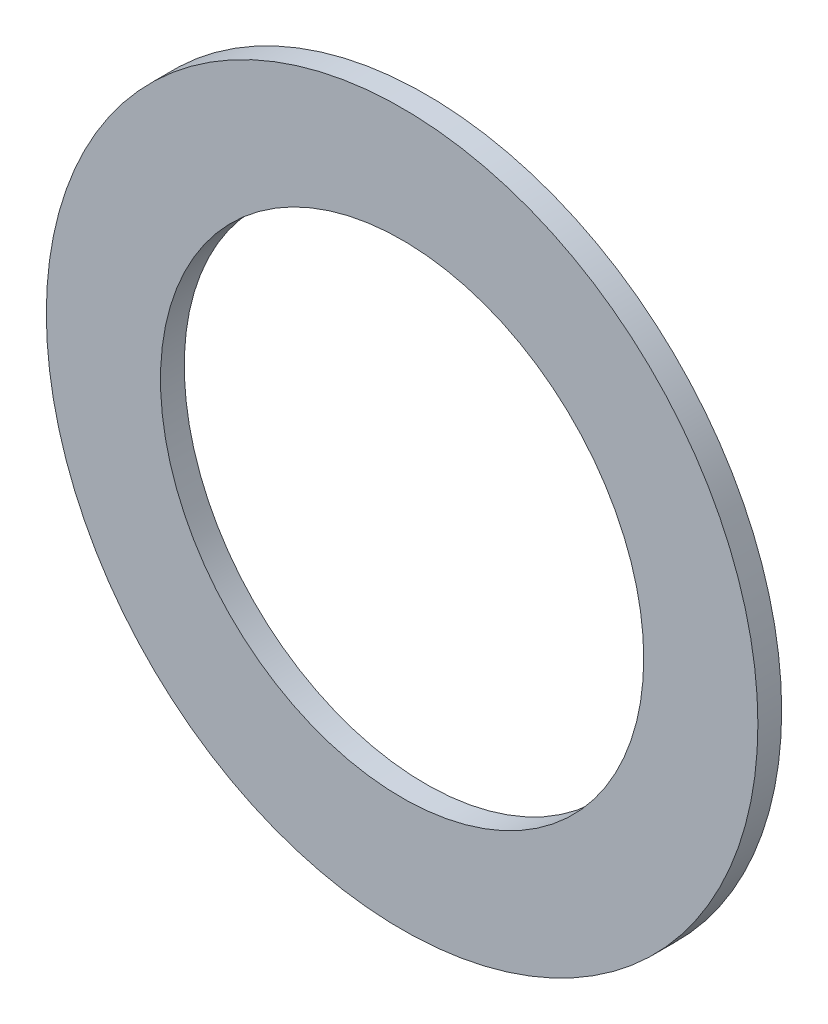
ISO-10303-21;
HEADER;
FILE_DESCRIPTION(('STEP AP214'),'2;1');
FILE_NAME('part.step','',(''),(''),'','','');
FILE_SCHEMA(('AUTOMOTIVE_DESIGN { 1 0 10303 214 1 1 1 1 }'));
ENDSEC;
DATA;
#1=APPLICATION_CONTEXT('core data for automotive mechanical design processes');
#2=APPLICATION_PROTOCOL_DEFINITION('international standard','automotive_design',2000,#1);
#3=PRODUCT_CONTEXT('',#1,'mechanical');
#4=PRODUCT('Part','Part','',(#3));
#5=PRODUCT_RELATED_PRODUCT_CATEGORY('part','',(#4));
#6=PRODUCT_DEFINITION_FORMATION('','',#4);
#7=PRODUCT_DEFINITION_CONTEXT('part definition',#1,'design');
#8=PRODUCT_DEFINITION('design','',#6,#7);
#9=PRODUCT_DEFINITION_SHAPE('','',#8);
#10=(LENGTH_UNIT() NAMED_UNIT(*) SI_UNIT(.MILLI.,.METRE.));
#11=(NAMED_UNIT(*) PLANE_ANGLE_UNIT() SI_UNIT($,.RADIAN.));
#12=(NAMED_UNIT(*) SI_UNIT($,.STERADIAN.) SOLID_ANGLE_UNIT());
#13=UNCERTAINTY_MEASURE_WITH_UNIT(LENGTH_MEASURE(1.E-05),#10,'distance_accuracy_value','');
#14=(GEOMETRIC_REPRESENTATION_CONTEXT(3) GLOBAL_UNCERTAINTY_ASSIGNED_CONTEXT((#13)) GLOBAL_UNIT_ASSIGNED_CONTEXT((#10,
#11,#12)) REPRESENTATION_CONTEXT('',''));
#15=CARTESIAN_POINT('',(0.,0.,0.));
#16=DIRECTION('',(0.,0.,1.));
#17=DIRECTION('',(1.,0.,0.));
#18=AXIS2_PLACEMENT_3D('',#15,#16,#17);
#19=CARTESIAN_POINT('',(0.,0.,1.5875));
#20=DIRECTION('',(0.,0.,-1.));
#21=DIRECTION('',(-1.,0.,0.));
#22=AXIS2_PLACEMENT_3D('',#19,#20,#21);
#23=CYLINDRICAL_SURFACE('',#22,23.749);
#24=CARTESIAN_POINT('',(0.,0.,1.5875));
#25=DIRECTION('',(0.,0.,1.));
#26=DIRECTION('',(1.,0.,0.));
#27=AXIS2_PLACEMENT_3D('',#24,#25,#26);
#28=CIRCLE('',#27,23.749);
#29=CARTESIAN_POINT('',(23.749,0.,1.5875));
#30=VERTEX_POINT('',#29);
#31=EDGE_CURVE('E10',#30,#30,#28,.T.);
#32=ORIENTED_EDGE('',*,*,#31,.F.);
#33=EDGE_LOOP('',(#32));
#34=FACE_BOUND('',#33,.T.);
#35=CARTESIAN_POINT('',(0.,0.,0.));
#36=DIRECTION('',(0.,0.,1.));
#37=DIRECTION('',(1.,0.,0.));
#38=AXIS2_PLACEMENT_3D('',#35,#36,#37);
#39=CIRCLE('',#38,23.749);
#40=CARTESIAN_POINT('',(23.749,0.,0.));
#41=VERTEX_POINT('',#40);
#42=EDGE_CURVE('E34',#41,#41,#39,.T.);
#43=ORIENTED_EDGE('',*,*,#42,.T.);
#44=EDGE_LOOP('',(#43));
#45=FACE_BOUND('',#44,.T.);
#46=ADVANCED_FACE('F31',(#34,#45),#23,.T.);
#47=CARTESIAN_POINT('',(0.,0.,1.5875));
#48=DIRECTION('',(0.,0.,1.));
#49=DIRECTION('',(1.,0.,0.));
#50=AXIS2_PLACEMENT_3D('',#47,#48,#49);
#51=PLANE('',#50);
#52=CARTESIAN_POINT('',(0.,0.,1.5875));
#53=DIRECTION('',(0.,0.,1.));
#54=DIRECTION('',(1.,0.,0.));
#55=AXIS2_PLACEMENT_3D('',#52,#53,#54);
#56=CIRCLE('',#55,16.129);
#57=CARTESIAN_POINT('',(16.129,0.,1.5875));
#58=VERTEX_POINT('',#57);
#59=EDGE_CURVE('E43',#58,#58,#56,.T.);
#60=ORIENTED_EDGE('',*,*,#59,.F.);
#61=EDGE_LOOP('',(#60));
#62=FACE_BOUND('',#61,.T.);
#63=ORIENTED_EDGE('',*,*,#31,.T.);
#64=EDGE_LOOP('',(#63));
#65=FACE_BOUND('',#64,.T.);
#66=ADVANCED_FACE('F58',(#62,#65),#51,.T.);
#67=CARTESIAN_POINT('',(0.,0.,0.));
#68=DIRECTION('',(0.,0.,1.));
#69=DIRECTION('',(1.,0.,0.));
#70=AXIS2_PLACEMENT_3D('',#67,#68,#69);
#71=PLANE('',#70);
#72=CARTESIAN_POINT('',(0.,0.,0.));
#73=DIRECTION('',(0.,0.,1.));
#74=DIRECTION('',(1.,0.,0.));
#75=AXIS2_PLACEMENT_3D('',#72,#73,#74);
#76=CIRCLE('',#75,16.129);
#77=CARTESIAN_POINT('',(16.129,0.,0.));
#78=VERTEX_POINT('',#77);
#79=EDGE_CURVE('E41',#78,#78,#76,.T.);
#80=ORIENTED_EDGE('',*,*,#79,.T.);
#81=EDGE_LOOP('',(#80));
#82=FACE_BOUND('',#81,.T.);
#83=ORIENTED_EDGE('',*,*,#42,.F.);
#84=EDGE_LOOP('',(#83));
#85=FACE_BOUND('',#84,.T.);
#86=ADVANCED_FACE('F49',(#82,#85),#71,.F.);
#87=CARTESIAN_POINT('',(0.,0.,0.));
#88=DIRECTION('',(0.,0.,1.));
#89=DIRECTION('',(1.,0.,0.));
#90=AXIS2_PLACEMENT_3D('',#87,#88,#89);
#91=CYLINDRICAL_SURFACE('',#90,16.129);
#92=ORIENTED_EDGE('',*,*,#79,.F.);
#93=EDGE_LOOP('',(#92));
#94=FACE_BOUND('',#93,.T.);
#95=ORIENTED_EDGE('',*,*,#59,.T.);
#96=EDGE_LOOP('',(#95));
#97=FACE_BOUND('',#96,.T.);
#98=ADVANCED_FACE('F52',(#94,#97),#91,.F.);
#99=CLOSED_SHELL('',(#46,#66,#86,#98));
#100=MANIFOLD_SOLID_BREP('B2',#99);
#101=ADVANCED_BREP_SHAPE_REPRESENTATION('',(#18,#100),#14);
#102=SHAPE_DEFINITION_REPRESENTATION(#9,#101);
ENDSEC;
END-ISO-10303-21;
